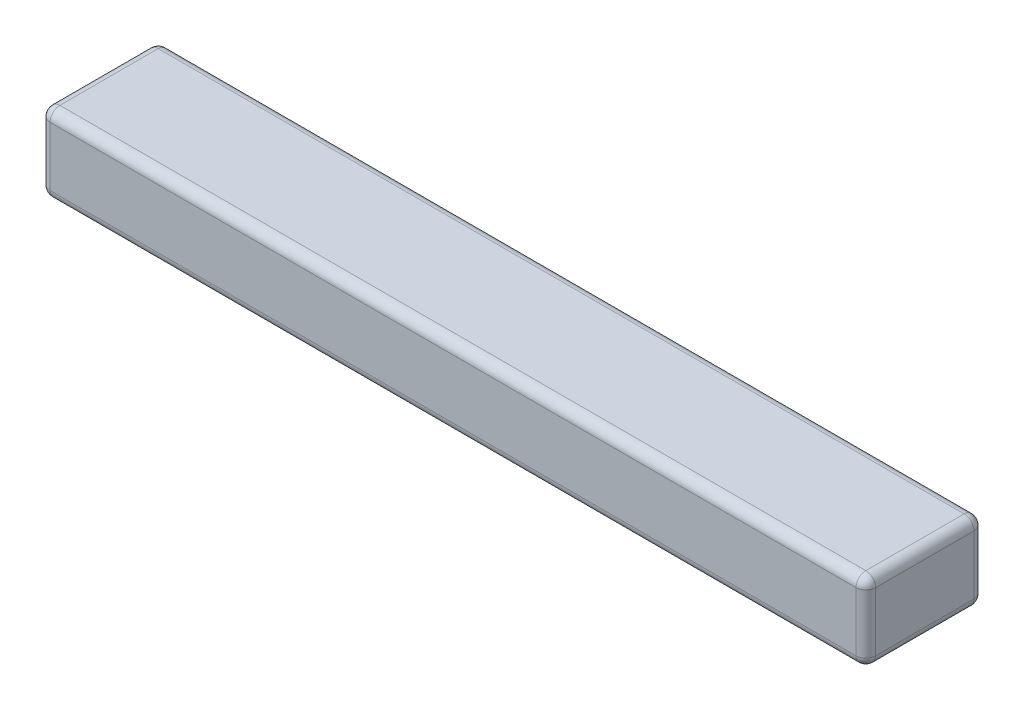
ISO-10303-21;
HEADER;
FILE_DESCRIPTION(('STEP AP214'),'2;1');
FILE_NAME('part.step','',(''),(''),'','','');
FILE_SCHEMA(('AUTOMOTIVE_DESIGN { 1 0 10303 214 1 1 1 1 }'));
ENDSEC;
DATA;
#1=APPLICATION_CONTEXT('core data for automotive mechanical design processes');
#2=APPLICATION_PROTOCOL_DEFINITION('international standard','automotive_design',2000,#1);
#3=PRODUCT_CONTEXT('',#1,'mechanical');
#4=PRODUCT('Part','Part','',(#3));
#5=PRODUCT_RELATED_PRODUCT_CATEGORY('part','',(#4));
#6=PRODUCT_DEFINITION_FORMATION('','',#4);
#7=PRODUCT_DEFINITION_CONTEXT('part definition',#1,'design');
#8=PRODUCT_DEFINITION('design','',#6,#7);
#9=PRODUCT_DEFINITION_SHAPE('','',#8);
#10=(LENGTH_UNIT() NAMED_UNIT(*) SI_UNIT(.MILLI.,.METRE.));
#11=(NAMED_UNIT(*) PLANE_ANGLE_UNIT() SI_UNIT($,.RADIAN.));
#12=(NAMED_UNIT(*) SI_UNIT($,.STERADIAN.) SOLID_ANGLE_UNIT());
#13=UNCERTAINTY_MEASURE_WITH_UNIT(LENGTH_MEASURE(1.E-05),#10,'distance_accuracy_value','');
#14=(GEOMETRIC_REPRESENTATION_CONTEXT(3) GLOBAL_UNCERTAINTY_ASSIGNED_CONTEXT((#13)) GLOBAL_UNIT_ASSIGNED_CONTEXT((#10,
#11,#12)) REPRESENTATION_CONTEXT('',''));
#15=CARTESIAN_POINT('',(0.,0.,0.));
#16=DIRECTION('',(0.,0.,1.));
#17=DIRECTION('',(1.,0.,0.));
#18=AXIS2_PLACEMENT_3D('',#15,#16,#17);
#19=CARTESIAN_POINT('',(210.,-20.,-30.));
#20=DIRECTION('',(0.,0.,1.));
#21=DIRECTION('',(1.,0.,0.));
#22=AXIS2_PLACEMENT_3D('',#19,#20,#21);
#23=PLANE('',#22);
#24=DIRECTION('',(0.,1.,0.));
#25=VECTOR('',#24,1.);
#26=CARTESIAN_POINT('',(205.,-20.,-30.));
#27=LINE('',#26,#25);
#28=CARTESIAN_POINT('',(205.,15.,-30.));
#29=VERTEX_POINT('',#28);
#30=CARTESIAN_POINT('',(205.,-15.,-30.));
#31=VERTEX_POINT('',#30);
#32=EDGE_CURVE('E175',#29,#31,#27,.F.);
#33=ORIENTED_EDGE('',*,*,#32,.T.);
#34=DIRECTION('',(-1.,0.,0.));
#35=VECTOR('',#34,1.);
#36=CARTESIAN_POINT('',(210.,-15.,-30.));
#37=LINE('',#36,#35);
#38=CARTESIAN_POINT('',(-205.,-15.,-30.));
#39=VERTEX_POINT('',#38);
#40=EDGE_CURVE('E180',#31,#39,#37,.T.);
#41=ORIENTED_EDGE('',*,*,#40,.T.);
#42=DIRECTION('',(0.,1.,0.));
#43=VECTOR('',#42,1.);
#44=CARTESIAN_POINT('',(-205.,20.,-30.));
#45=LINE('',#44,#43);
#46=CARTESIAN_POINT('',(-205.,15.,-30.));
#47=VERTEX_POINT('',#46);
#48=EDGE_CURVE('E177',#39,#47,#45,.T.);
#49=ORIENTED_EDGE('',*,*,#48,.T.);
#50=DIRECTION('',(-1.,0.,0.));
#51=VECTOR('',#50,1.);
#52=CARTESIAN_POINT('',(210.,15.,-30.));
#53=LINE('',#52,#51);
#54=EDGE_CURVE('E173',#47,#29,#53,.F.);
#55=ORIENTED_EDGE('',*,*,#54,.T.);
#56=EDGE_LOOP('',(#33,#41,#49,#55));
#57=FACE_BOUND('',#56,.T.);
#58=ADVANCED_FACE('F32',(#57),#23,.F.);
#59=CARTESIAN_POINT('',(210.,20.,30.));
#60=DIRECTION('',(0.,-1.,0.));
#61=DIRECTION('',(0.,0.,-1.));
#62=AXIS2_PLACEMENT_3D('',#59,#60,#61);
#63=PLANE('',#62);
#64=DIRECTION('',(0.,0.,1.));
#65=VECTOR('',#64,1.);
#66=CARTESIAN_POINT('',(205.,20.,30.));
#67=LINE('',#66,#65);
#68=CARTESIAN_POINT('',(205.,20.,25.));
#69=VERTEX_POINT('',#68);
#70=CARTESIAN_POINT('',(205.,20.,-25.));
#71=VERTEX_POINT('',#70);
#72=EDGE_CURVE('E184',#69,#71,#67,.F.);
#73=ORIENTED_EDGE('',*,*,#72,.T.);
#74=DIRECTION('',(-1.,0.,0.));
#75=VECTOR('',#74,1.);
#76=CARTESIAN_POINT('',(210.,20.,-25.));
#77=LINE('',#76,#75);
#78=CARTESIAN_POINT('',(-205.,20.,-25.));
#79=VERTEX_POINT('',#78);
#80=EDGE_CURVE('E189',#71,#79,#77,.T.);
#81=ORIENTED_EDGE('',*,*,#80,.T.);
#82=DIRECTION('',(0.,0.,1.));
#83=VECTOR('',#82,1.);
#84=CARTESIAN_POINT('',(-205.,20.,30.));
#85=LINE('',#84,#83);
#86=CARTESIAN_POINT('',(-205.,20.,25.));
#87=VERTEX_POINT('',#86);
#88=EDGE_CURVE('E186',#79,#87,#85,.T.);
#89=ORIENTED_EDGE('',*,*,#88,.T.);
#90=DIRECTION('',(-1.,0.,0.));
#91=VECTOR('',#90,1.);
#92=CARTESIAN_POINT('',(210.,20.,25.));
#93=LINE('',#92,#91);
#94=EDGE_CURVE('E182',#87,#69,#93,.F.);
#95=ORIENTED_EDGE('',*,*,#94,.T.);
#96=EDGE_LOOP('',(#73,#81,#89,#95));
#97=FACE_BOUND('',#96,.T.);
#98=ADVANCED_FACE('F286',(#97),#63,.F.);
#99=CARTESIAN_POINT('',(210.,-20.,30.));
#100=DIRECTION('',(0.,0.,-1.));
#101=DIRECTION('',(-1.,0.,0.));
#102=AXIS2_PLACEMENT_3D('',#99,#100,#101);
#103=PLANE('',#102);
#104=DIRECTION('',(0.,-1.,0.));
#105=VECTOR('',#104,1.);
#106=CARTESIAN_POINT('',(-205.,-20.,30.));
#107=LINE('',#106,#105);
#108=CARTESIAN_POINT('',(-205.,15.,30.));
#109=VERTEX_POINT('',#108);
#110=CARTESIAN_POINT('',(-205.,-15.,30.));
#111=VERTEX_POINT('',#110);
#112=EDGE_CURVE('E195',#109,#111,#107,.T.);
#113=ORIENTED_EDGE('',*,*,#112,.T.);
#114=DIRECTION('',(-1.,0.,0.));
#115=VECTOR('',#114,1.);
#116=CARTESIAN_POINT('',(210.,-15.,30.));
#117=LINE('',#116,#115);
#118=CARTESIAN_POINT('',(205.,-15.,30.));
#119=VERTEX_POINT('',#118);
#120=EDGE_CURVE('E198',#111,#119,#117,.F.);
#121=ORIENTED_EDGE('',*,*,#120,.T.);
#122=DIRECTION('',(0.,-1.,0.));
#123=VECTOR('',#122,1.);
#124=CARTESIAN_POINT('',(205.,-20.,30.));
#125=LINE('',#124,#123);
#126=CARTESIAN_POINT('',(205.,15.,30.));
#127=VERTEX_POINT('',#126);
#128=EDGE_CURVE('E193',#119,#127,#125,.F.);
#129=ORIENTED_EDGE('',*,*,#128,.T.);
#130=DIRECTION('',(-1.,0.,0.));
#131=VECTOR('',#130,1.);
#132=CARTESIAN_POINT('',(210.,15.,30.));
#133=LINE('',#132,#131);
#134=EDGE_CURVE('E191',#127,#109,#133,.T.);
#135=ORIENTED_EDGE('',*,*,#134,.T.);
#136=EDGE_LOOP('',(#113,#121,#129,#135));
#137=FACE_BOUND('',#136,.T.);
#138=ADVANCED_FACE('F306',(#137),#103,.F.);
#139=CARTESIAN_POINT('',(210.,-20.,30.));
#140=DIRECTION('',(0.,1.,0.));
#141=DIRECTION('',(0.,0.,1.));
#142=AXIS2_PLACEMENT_3D('',#139,#140,#141);
#143=PLANE('',#142);
#144=DIRECTION('',(0.,0.,-1.));
#145=VECTOR('',#144,1.);
#146=CARTESIAN_POINT('',(-205.,-20.,-30.));
#147=LINE('',#146,#145);
#148=CARTESIAN_POINT('',(-205.,-20.,25.));
#149=VERTEX_POINT('',#148);
#150=CARTESIAN_POINT('',(-205.,-20.,-25.));
#151=VERTEX_POINT('',#150);
#152=EDGE_CURVE('E135',#149,#151,#147,.T.);
#153=ORIENTED_EDGE('',*,*,#152,.T.);
#154=DIRECTION('',(-1.,0.,0.));
#155=VECTOR('',#154,1.);
#156=CARTESIAN_POINT('',(210.,-20.,-25.));
#157=LINE('',#156,#155);
#158=CARTESIAN_POINT('',(205.,-20.,-25.));
#159=VERTEX_POINT('',#158);
#160=EDGE_CURVE('E131',#151,#159,#157,.F.);
#161=ORIENTED_EDGE('',*,*,#160,.T.);
#162=DIRECTION('',(0.,0.,-1.));
#163=VECTOR('',#162,1.);
#164=CARTESIAN_POINT('',(205.,-20.,30.));
#165=LINE('',#164,#163);
#166=CARTESIAN_POINT('',(205.,-20.,25.));
#167=VERTEX_POINT('',#166);
#168=EDGE_CURVE('E123',#159,#167,#165,.F.);
#169=ORIENTED_EDGE('',*,*,#168,.T.);
#170=DIRECTION('',(-1.,0.,0.));
#171=VECTOR('',#170,1.);
#172=CARTESIAN_POINT('',(210.,-20.,25.));
#173=LINE('',#172,#171);
#174=EDGE_CURVE('E128',#167,#149,#173,.T.);
#175=ORIENTED_EDGE('',*,*,#174,.T.);
#176=EDGE_LOOP('',(#153,#161,#169,#175));
#177=FACE_BOUND('',#176,.T.);
#178=ADVANCED_FACE('F126',(#177),#143,.F.);
#179=CARTESIAN_POINT('',(210.,0.,0.));
#180=DIRECTION('',(-1.,0.,0.));
#181=DIRECTION('',(0.,0.,1.));
#182=AXIS2_PLACEMENT_3D('',#179,#180,#181);
#183=PLANE('',#182);
#184=DIRECTION('',(0.,0.,-1.));
#185=VECTOR('',#184,1.);
#186=CARTESIAN_POINT('',(210.,-15.,0.));
#187=LINE('',#186,#185);
#188=CARTESIAN_POINT('',(210.,-15.,25.));
#189=VERTEX_POINT('',#188);
#190=CARTESIAN_POINT('',(210.,-15.,-25.));
#191=VERTEX_POINT('',#190);
#192=EDGE_CURVE('E56',#189,#191,#187,.T.);
#193=ORIENTED_EDGE('',*,*,#192,.T.);
#194=DIRECTION('',(0.,1.,0.));
#195=VECTOR('',#194,1.);
#196=CARTESIAN_POINT('',(210.,0.,-25.));
#197=LINE('',#196,#195);
#198=CARTESIAN_POINT('',(210.,15.,-25.));
#199=VERTEX_POINT('',#198);
#200=EDGE_CURVE('E11',#191,#199,#197,.T.);
#201=ORIENTED_EDGE('',*,*,#200,.T.);
#202=DIRECTION('',(0.,0.,1.));
#203=VECTOR('',#202,1.);
#204=CARTESIAN_POINT('',(210.,15.,0.));
#205=LINE('',#204,#203);
#206=CARTESIAN_POINT('',(210.,15.,25.));
#207=VERTEX_POINT('',#206);
#208=EDGE_CURVE('E41',#199,#207,#205,.T.);
#209=ORIENTED_EDGE('',*,*,#208,.T.);
#210=DIRECTION('',(0.,-1.,0.));
#211=VECTOR('',#210,1.);
#212=CARTESIAN_POINT('',(210.,0.,25.));
#213=LINE('',#212,#211);
#214=EDGE_CURVE('E200',#207,#189,#213,.T.);
#215=ORIENTED_EDGE('',*,*,#214,.T.);
#216=EDGE_LOOP('',(#193,#201,#209,#215));
#217=FACE_BOUND('',#216,.T.);
#218=ADVANCED_FACE('F259',(#217),#183,.F.);
#219=CARTESIAN_POINT('',(-210.,0.,0.));
#220=DIRECTION('',(-1.,0.,0.));
#221=DIRECTION('',(0.,0.,1.));
#222=AXIS2_PLACEMENT_3D('',#219,#220,#221);
#223=PLANE('',#222);
#224=DIRECTION('',(0.,1.,0.));
#225=VECTOR('',#224,1.);
#226=CARTESIAN_POINT('',(-210.,-20.,-25.));
#227=LINE('',#226,#225);
#228=CARTESIAN_POINT('',(-210.,15.,-25.));
#229=VERTEX_POINT('',#228);
#230=CARTESIAN_POINT('',(-210.,-15.,-25.));
#231=VERTEX_POINT('',#230);
#232=EDGE_CURVE('E168',#229,#231,#227,.F.);
#233=ORIENTED_EDGE('',*,*,#232,.T.);
#234=DIRECTION('',(0.,0.,-1.));
#235=VECTOR('',#234,1.);
#236=CARTESIAN_POINT('',(-210.,-15.,30.));
#237=LINE('',#236,#235);
#238=CARTESIAN_POINT('',(-210.,-15.,25.));
#239=VERTEX_POINT('',#238);
#240=EDGE_CURVE('E170',#231,#239,#237,.F.);
#241=ORIENTED_EDGE('',*,*,#240,.T.);
#242=DIRECTION('',(0.,-1.,0.));
#243=VECTOR('',#242,1.);
#244=CARTESIAN_POINT('',(-210.,20.,25.));
#245=LINE('',#244,#243);
#246=CARTESIAN_POINT('',(-210.,15.,25.));
#247=VERTEX_POINT('',#246);
#248=EDGE_CURVE('E164',#239,#247,#245,.F.);
#249=ORIENTED_EDGE('',*,*,#248,.T.);
#250=DIRECTION('',(0.,0.,1.));
#251=VECTOR('',#250,1.);
#252=CARTESIAN_POINT('',(-210.,15.,-30.));
#253=LINE('',#252,#251);
#254=EDGE_CURVE('E166',#247,#229,#253,.F.);
#255=ORIENTED_EDGE('',*,*,#254,.T.);
#256=EDGE_LOOP('',(#233,#241,#249,#255));
#257=FACE_BOUND('',#256,.T.);
#258=ADVANCED_FACE('F339',(#257),#223,.T.);
#259=CARTESIAN_POINT('',(205.,15.,0.));
#260=DIRECTION('',(0.,0.,1.));
#261=DIRECTION('',(1.,0.,0.));
#262=AXIS2_PLACEMENT_3D('',#259,#260,#261);
#263=CYLINDRICAL_SURFACE('',#262,5.);
#264=CARTESIAN_POINT('',(205.,15.,25.));
#265=DIRECTION('',(0.,0.,1.));
#266=DIRECTION('',(1.,0.,0.));
#267=AXIS2_PLACEMENT_3D('',#264,#265,#266);
#268=CIRCLE('',#267,5.);
#269=EDGE_CURVE('E36',#207,#69,#268,.T.);
#270=ORIENTED_EDGE('',*,*,#269,.F.);
#271=ORIENTED_EDGE('',*,*,#208,.F.);
#272=CARTESIAN_POINT('',(205.,15.,-25.));
#273=DIRECTION('',(0.,0.,-1.));
#274=DIRECTION('',(-1.,0.,0.));
#275=AXIS2_PLACEMENT_3D('',#272,#273,#274);
#276=CIRCLE('',#275,5.);
#277=EDGE_CURVE('E160',#71,#199,#276,.T.);
#278=ORIENTED_EDGE('',*,*,#277,.F.);
#279=ORIENTED_EDGE('',*,*,#72,.F.);
#280=EDGE_LOOP('',(#270,#271,#278,#279));
#281=FACE_BOUND('',#280,.T.);
#282=ADVANCED_FACE('F34',(#281),#263,.T.);
#283=CARTESIAN_POINT('',(205.,15.,25.));
#284=DIRECTION('',(0.,0.,1.));
#285=DIRECTION('',(1.,0.,0.));
#286=AXIS2_PLACEMENT_3D('',#283,#284,#285);
#287=SPHERICAL_SURFACE('',#286,5.);
#288=CARTESIAN_POINT('',(205.,15.,25.));
#289=DIRECTION('',(0.,1.,0.));
#290=DIRECTION('',(-1.,0.,0.));
#291=AXIS2_PLACEMENT_3D('',#288,#289,#290);
#292=CIRCLE('',#291,5.);
#293=EDGE_CURVE('E244',#207,#127,#292,.F.);
#294=ORIENTED_EDGE('',*,*,#293,.F.);
#295=ORIENTED_EDGE('',*,*,#269,.T.);
#296=CARTESIAN_POINT('',(205.,15.,25.));
#297=DIRECTION('',(1.,0.,0.));
#298=DIRECTION('',(0.,0.,-1.));
#299=AXIS2_PLACEMENT_3D('',#296,#297,#298);
#300=CIRCLE('',#299,5.);
#301=EDGE_CURVE('E247',#127,#69,#300,.F.);
#302=ORIENTED_EDGE('',*,*,#301,.F.);
#303=EDGE_LOOP('',(#294,#295,#302));
#304=FACE_BOUND('',#303,.T.);
#305=ADVANCED_FACE('F300',(#304),#287,.T.);
#306=CARTESIAN_POINT('',(205.,15.,-25.));
#307=DIRECTION('',(0.,0.,1.));
#308=DIRECTION('',(1.,0.,0.));
#309=AXIS2_PLACEMENT_3D('',#306,#307,#308);
#310=SPHERICAL_SURFACE('',#309,5.);
#311=CARTESIAN_POINT('',(205.,15.,-25.));
#312=DIRECTION('',(1.,0.,0.));
#313=DIRECTION('',(0.,0.,-1.));
#314=AXIS2_PLACEMENT_3D('',#311,#312,#313);
#315=CIRCLE('',#314,5.);
#316=EDGE_CURVE('E240',#71,#29,#315,.F.);
#317=ORIENTED_EDGE('',*,*,#316,.F.);
#318=ORIENTED_EDGE('',*,*,#277,.T.);
#319=CARTESIAN_POINT('',(205.,15.,-25.));
#320=DIRECTION('',(0.,1.,0.));
#321=DIRECTION('',(0.,0.,1.));
#322=AXIS2_PLACEMENT_3D('',#319,#320,#321);
#323=CIRCLE('',#322,5.);
#324=EDGE_CURVE('E49',#29,#199,#323,.F.);
#325=ORIENTED_EDGE('',*,*,#324,.F.);
#326=EDGE_LOOP('',(#317,#318,#325));
#327=FACE_BOUND('',#326,.T.);
#328=ADVANCED_FACE('F253',(#327),#310,.T.);
#329=CARTESIAN_POINT('',(210.,15.,25.));
#330=DIRECTION('',(-1.,0.,0.));
#331=DIRECTION('',(0.,0.,1.));
#332=AXIS2_PLACEMENT_3D('',#329,#330,#331);
#333=CYLINDRICAL_SURFACE('',#332,5.);
#334=ORIENTED_EDGE('',*,*,#301,.T.);
#335=ORIENTED_EDGE('',*,*,#94,.F.);
#336=CARTESIAN_POINT('',(-205.,15.,25.));
#337=DIRECTION('',(-1.,0.,0.));
#338=DIRECTION('',(0.,0.,1.));
#339=AXIS2_PLACEMENT_3D('',#336,#337,#338);
#340=CIRCLE('',#339,5.);
#341=EDGE_CURVE('E235',#109,#87,#340,.T.);
#342=ORIENTED_EDGE('',*,*,#341,.F.);
#343=ORIENTED_EDGE('',*,*,#134,.F.);
#344=EDGE_LOOP('',(#334,#335,#342,#343));
#345=FACE_BOUND('',#344,.T.);
#346=ADVANCED_FACE('F296',(#345),#333,.T.);
#347=CARTESIAN_POINT('',(205.,0.,25.));
#348=DIRECTION('',(0.,-1.,0.));
#349=DIRECTION('',(0.,0.,-1.));
#350=AXIS2_PLACEMENT_3D('',#347,#348,#349);
#351=CYLINDRICAL_SURFACE('',#350,5.);
#352=ORIENTED_EDGE('',*,*,#293,.T.);
#353=ORIENTED_EDGE('',*,*,#128,.F.);
#354=CARTESIAN_POINT('',(205.,-15.,25.));
#355=DIRECTION('',(0.,-1.,0.));
#356=DIRECTION('',(0.,0.,-1.));
#357=AXIS2_PLACEMENT_3D('',#354,#355,#356);
#358=CIRCLE('',#357,5.);
#359=EDGE_CURVE('E144',#189,#119,#358,.T.);
#360=ORIENTED_EDGE('',*,*,#359,.F.);
#361=ORIENTED_EDGE('',*,*,#214,.F.);
#362=EDGE_LOOP('',(#352,#353,#360,#361));
#363=FACE_BOUND('',#362,.T.);
#364=ADVANCED_FACE('F304',(#363),#351,.T.);
#365=CARTESIAN_POINT('',(205.,-15.,0.));
#366=DIRECTION('',(0.,0.,-1.));
#367=DIRECTION('',(-1.,0.,0.));
#368=AXIS2_PLACEMENT_3D('',#365,#366,#367);
#369=CYLINDRICAL_SURFACE('',#368,5.);
#370=CARTESIAN_POINT('',(205.,-15.,-25.));
#371=DIRECTION('',(0.,0.,-1.));
#372=DIRECTION('',(-1.,0.,0.));
#373=AXIS2_PLACEMENT_3D('',#370,#371,#372);
#374=CIRCLE('',#373,5.);
#375=EDGE_CURVE('E145',#191,#159,#374,.T.);
#376=ORIENTED_EDGE('',*,*,#375,.F.);
#377=ORIENTED_EDGE('',*,*,#192,.F.);
#378=CARTESIAN_POINT('',(205.,-15.,25.));
#379=DIRECTION('',(0.,0.,1.));
#380=DIRECTION('',(1.,0.,0.));
#381=AXIS2_PLACEMENT_3D('',#378,#379,#380);
#382=CIRCLE('',#381,5.);
#383=EDGE_CURVE('E138',#167,#189,#382,.T.);
#384=ORIENTED_EDGE('',*,*,#383,.F.);
#385=ORIENTED_EDGE('',*,*,#168,.F.);
#386=EDGE_LOOP('',(#376,#377,#384,#385));
#387=FACE_BOUND('',#386,.T.);
#388=ADVANCED_FACE('F140',(#387),#369,.T.);
#389=CARTESIAN_POINT('',(205.,0.,-25.));
#390=DIRECTION('',(0.,1.,0.));
#391=DIRECTION('',(0.,0.,1.));
#392=AXIS2_PLACEMENT_3D('',#389,#390,#391);
#393=CYLINDRICAL_SURFACE('',#392,5.);
#394=ORIENTED_EDGE('',*,*,#324,.T.);
#395=ORIENTED_EDGE('',*,*,#200,.F.);
#396=CARTESIAN_POINT('',(205.,-15.,-25.));
#397=DIRECTION('',(0.,-1.,0.));
#398=DIRECTION('',(0.,0.,-1.));
#399=AXIS2_PLACEMENT_3D('',#396,#397,#398);
#400=CIRCLE('',#399,5.);
#401=EDGE_CURVE('E230',#31,#191,#400,.T.);
#402=ORIENTED_EDGE('',*,*,#401,.F.);
#403=ORIENTED_EDGE('',*,*,#32,.F.);
#404=EDGE_LOOP('',(#394,#395,#402,#403));
#405=FACE_BOUND('',#404,.T.);
#406=ADVANCED_FACE('F261',(#405),#393,.T.);
#407=CARTESIAN_POINT('',(210.,15.,-25.));
#408=DIRECTION('',(-1.,0.,0.));
#409=DIRECTION('',(0.,0.,1.));
#410=AXIS2_PLACEMENT_3D('',#407,#408,#409);
#411=CYLINDRICAL_SURFACE('',#410,5.);
#412=ORIENTED_EDGE('',*,*,#316,.T.);
#413=ORIENTED_EDGE('',*,*,#54,.F.);
#414=CARTESIAN_POINT('',(-205.,15.,-25.));
#415=DIRECTION('',(-1.,0.,0.));
#416=DIRECTION('',(0.,0.,1.));
#417=AXIS2_PLACEMENT_3D('',#414,#415,#416);
#418=CIRCLE('',#417,5.);
#419=EDGE_CURVE('E227',#79,#47,#418,.T.);
#420=ORIENTED_EDGE('',*,*,#419,.F.);
#421=ORIENTED_EDGE('',*,*,#80,.F.);
#422=EDGE_LOOP('',(#412,#413,#420,#421));
#423=FACE_BOUND('',#422,.T.);
#424=ADVANCED_FACE('F283',(#423),#411,.T.);
#425=CARTESIAN_POINT('',(-205.,15.,30.));
#426=DIRECTION('',(0.,0.,-1.));
#427=DIRECTION('',(-1.,0.,0.));
#428=AXIS2_PLACEMENT_3D('',#425,#426,#427);
#429=CYLINDRICAL_SURFACE('',#428,5.);
#430=CARTESIAN_POINT('',(-205.,15.,25.));
#431=DIRECTION('',(0.,0.,1.));
#432=DIRECTION('',(1.,0.,0.));
#433=AXIS2_PLACEMENT_3D('',#430,#431,#432);
#434=CIRCLE('',#433,5.);
#435=EDGE_CURVE('E237',#87,#247,#434,.T.);
#436=ORIENTED_EDGE('',*,*,#435,.F.);
#437=ORIENTED_EDGE('',*,*,#88,.F.);
#438=CARTESIAN_POINT('',(-205.,15.,-25.));
#439=DIRECTION('',(0.,0.,-1.));
#440=DIRECTION('',(0.,1.,0.));
#441=AXIS2_PLACEMENT_3D('',#438,#439,#440);
#442=CIRCLE('',#441,5.);
#443=EDGE_CURVE('E224',#229,#79,#442,.T.);
#444=ORIENTED_EDGE('',*,*,#443,.F.);
#445=ORIENTED_EDGE('',*,*,#254,.F.);
#446=EDGE_LOOP('',(#436,#437,#444,#445));
#447=FACE_BOUND('',#446,.T.);
#448=ADVANCED_FACE('F289',(#447),#429,.T.);
#449=CARTESIAN_POINT('',(-205.,15.,25.));
#450=DIRECTION('',(0.,0.,1.));
#451=DIRECTION('',(1.,0.,0.));
#452=AXIS2_PLACEMENT_3D('',#449,#450,#451);
#453=SPHERICAL_SURFACE('',#452,5.);
#454=ORIENTED_EDGE('',*,*,#341,.T.);
#455=ORIENTED_EDGE('',*,*,#435,.T.);
#456=CARTESIAN_POINT('',(-205.,15.,25.));
#457=DIRECTION('',(0.,1.,0.));
#458=DIRECTION('',(0.,0.,1.));
#459=AXIS2_PLACEMENT_3D('',#456,#457,#458);
#460=CIRCLE('',#459,5.);
#461=EDGE_CURVE('E152',#109,#247,#460,.F.);
#462=ORIENTED_EDGE('',*,*,#461,.F.);
#463=EDGE_LOOP('',(#454,#455,#462));
#464=FACE_BOUND('',#463,.T.);
#465=ADVANCED_FACE('F404',(#464),#453,.T.);
#466=CARTESIAN_POINT('',(205.,-15.,25.));
#467=DIRECTION('',(0.,0.,1.));
#468=DIRECTION('',(1.,0.,0.));
#469=AXIS2_PLACEMENT_3D('',#466,#467,#468);
#470=SPHERICAL_SURFACE('',#469,5.);
#471=ORIENTED_EDGE('',*,*,#383,.T.);
#472=ORIENTED_EDGE('',*,*,#359,.T.);
#473=CARTESIAN_POINT('',(205.,-15.,25.));
#474=DIRECTION('',(1.,0.,0.));
#475=DIRECTION('',(0.,0.,-1.));
#476=AXIS2_PLACEMENT_3D('',#473,#474,#475);
#477=CIRCLE('',#476,5.);
#478=EDGE_CURVE('E148',#167,#119,#477,.F.);
#479=ORIENTED_EDGE('',*,*,#478,.F.);
#480=EDGE_LOOP('',(#471,#472,#479));
#481=FACE_BOUND('',#480,.T.);
#482=ADVANCED_FACE('F149',(#481),#470,.T.);
#483=CARTESIAN_POINT('',(205.,-15.,-25.));
#484=DIRECTION('',(0.,0.,1.));
#485=DIRECTION('',(1.,0.,0.));
#486=AXIS2_PLACEMENT_3D('',#483,#484,#485);
#487=SPHERICAL_SURFACE('',#486,5.);
#488=ORIENTED_EDGE('',*,*,#401,.T.);
#489=ORIENTED_EDGE('',*,*,#375,.T.);
#490=CARTESIAN_POINT('',(205.,-15.,-25.));
#491=DIRECTION('',(1.,0.,0.));
#492=DIRECTION('',(0.,0.,-1.));
#493=AXIS2_PLACEMENT_3D('',#490,#491,#492);
#494=CIRCLE('',#493,5.);
#495=EDGE_CURVE('E153',#31,#159,#494,.F.);
#496=ORIENTED_EDGE('',*,*,#495,.F.);
#497=EDGE_LOOP('',(#488,#489,#496));
#498=FACE_BOUND('',#497,.T.);
#499=ADVANCED_FACE('F264',(#498),#487,.T.);
#500=CARTESIAN_POINT('',(-205.,15.,-25.));
#501=DIRECTION('',(0.,0.,1.));
#502=DIRECTION('',(1.,0.,0.));
#503=AXIS2_PLACEMENT_3D('',#500,#501,#502);
#504=SPHERICAL_SURFACE('',#503,5.);
#505=ORIENTED_EDGE('',*,*,#443,.T.);
#506=ORIENTED_EDGE('',*,*,#419,.T.);
#507=CARTESIAN_POINT('',(-205.,15.,-25.));
#508=DIRECTION('',(0.,1.,0.));
#509=DIRECTION('',(0.,0.,1.));
#510=AXIS2_PLACEMENT_3D('',#507,#508,#509);
#511=CIRCLE('',#510,5.);
#512=EDGE_CURVE('E218',#229,#47,#511,.F.);
#513=ORIENTED_EDGE('',*,*,#512,.F.);
#514=EDGE_LOOP('',(#505,#506,#513));
#515=FACE_BOUND('',#514,.T.);
#516=ADVANCED_FACE('F280',(#515),#504,.T.);
#517=CARTESIAN_POINT('',(-205.,-20.,25.));
#518=DIRECTION('',(0.,1.,0.));
#519=DIRECTION('',(0.,0.,1.));
#520=AXIS2_PLACEMENT_3D('',#517,#518,#519);
#521=CYLINDRICAL_SURFACE('',#520,5.);
#522=ORIENTED_EDGE('',*,*,#461,.T.);
#523=ORIENTED_EDGE('',*,*,#248,.F.);
#524=CARTESIAN_POINT('',(-205.,-15.,25.));
#525=DIRECTION('',(0.,-1.,0.));
#526=DIRECTION('',(0.,0.,-1.));
#527=AXIS2_PLACEMENT_3D('',#524,#525,#526);
#528=CIRCLE('',#527,5.);
#529=EDGE_CURVE('E215',#111,#239,#528,.T.);
#530=ORIENTED_EDGE('',*,*,#529,.F.);
#531=ORIENTED_EDGE('',*,*,#112,.F.);
#532=EDGE_LOOP('',(#522,#523,#530,#531));
#533=FACE_BOUND('',#532,.T.);
#534=ADVANCED_FACE('F310',(#533),#521,.T.);
#535=CARTESIAN_POINT('',(210.,-15.,25.));
#536=DIRECTION('',(-1.,0.,0.));
#537=DIRECTION('',(0.,0.,1.));
#538=AXIS2_PLACEMENT_3D('',#535,#536,#537);
#539=CYLINDRICAL_SURFACE('',#538,5.);
#540=ORIENTED_EDGE('',*,*,#478,.T.);
#541=ORIENTED_EDGE('',*,*,#120,.F.);
#542=CARTESIAN_POINT('',(-205.,-15.,25.));
#543=DIRECTION('',(-1.,0.,0.));
#544=DIRECTION('',(0.,0.,1.));
#545=AXIS2_PLACEMENT_3D('',#542,#543,#544);
#546=CIRCLE('',#545,5.);
#547=EDGE_CURVE('E156',#149,#111,#546,.T.);
#548=ORIENTED_EDGE('',*,*,#547,.F.);
#549=ORIENTED_EDGE('',*,*,#174,.F.);
#550=EDGE_LOOP('',(#540,#541,#548,#549));
#551=FACE_BOUND('',#550,.T.);
#552=ADVANCED_FACE('F155',(#551),#539,.T.);
#553=CARTESIAN_POINT('',(210.,-15.,-25.));
#554=DIRECTION('',(-1.,0.,0.));
#555=DIRECTION('',(0.,0.,1.));
#556=AXIS2_PLACEMENT_3D('',#553,#554,#555);
#557=CYLINDRICAL_SURFACE('',#556,5.);
#558=ORIENTED_EDGE('',*,*,#495,.T.);
#559=ORIENTED_EDGE('',*,*,#160,.F.);
#560=CARTESIAN_POINT('',(-205.,-15.,-25.));
#561=DIRECTION('',(-1.,0.,0.));
#562=DIRECTION('',(0.,0.,1.));
#563=AXIS2_PLACEMENT_3D('',#560,#561,#562);
#564=CIRCLE('',#563,5.);
#565=EDGE_CURVE('E211',#39,#151,#564,.T.);
#566=ORIENTED_EDGE('',*,*,#565,.F.);
#567=ORIENTED_EDGE('',*,*,#40,.F.);
#568=EDGE_LOOP('',(#558,#559,#566,#567));
#569=FACE_BOUND('',#568,.T.);
#570=ADVANCED_FACE('F268',(#569),#557,.T.);
#571=CARTESIAN_POINT('',(-205.,-20.,-25.));
#572=DIRECTION('',(0.,-1.,0.));
#573=DIRECTION('',(0.,0.,-1.));
#574=AXIS2_PLACEMENT_3D('',#571,#572,#573);
#575=CYLINDRICAL_SURFACE('',#574,5.);
#576=ORIENTED_EDGE('',*,*,#512,.T.);
#577=ORIENTED_EDGE('',*,*,#48,.F.);
#578=CARTESIAN_POINT('',(-205.,-15.,-25.));
#579=DIRECTION('',(0.,-1.,0.));
#580=DIRECTION('',(0.,0.,-1.));
#581=AXIS2_PLACEMENT_3D('',#578,#579,#580);
#582=CIRCLE('',#581,5.);
#583=EDGE_CURVE('E208',#231,#39,#582,.T.);
#584=ORIENTED_EDGE('',*,*,#583,.F.);
#585=ORIENTED_EDGE('',*,*,#232,.F.);
#586=EDGE_LOOP('',(#576,#577,#584,#585));
#587=FACE_BOUND('',#586,.T.);
#588=ADVANCED_FACE('F273',(#587),#575,.T.);
#589=CARTESIAN_POINT('',(-205.,-15.,25.));
#590=DIRECTION('',(0.,0.,1.));
#591=DIRECTION('',(1.,0.,0.));
#592=AXIS2_PLACEMENT_3D('',#589,#590,#591);
#593=SPHERICAL_SURFACE('',#592,5.);
#594=ORIENTED_EDGE('',*,*,#547,.T.);
#595=ORIENTED_EDGE('',*,*,#529,.T.);
#596=CARTESIAN_POINT('',(-205.,-15.,25.));
#597=DIRECTION('',(0.,0.,1.));
#598=DIRECTION('',(1.,0.,0.));
#599=AXIS2_PLACEMENT_3D('',#596,#597,#598);
#600=CIRCLE('',#599,5.);
#601=EDGE_CURVE('E206',#149,#239,#600,.F.);
#602=ORIENTED_EDGE('',*,*,#601,.F.);
#603=EDGE_LOOP('',(#594,#595,#602));
#604=FACE_BOUND('',#603,.T.);
#605=ADVANCED_FACE('F313',(#604),#593,.T.);
#606=CARTESIAN_POINT('',(-205.,-15.,-25.));
#607=DIRECTION('',(0.,0.,1.));
#608=DIRECTION('',(1.,0.,0.));
#609=AXIS2_PLACEMENT_3D('',#606,#607,#608);
#610=SPHERICAL_SURFACE('',#609,5.);
#611=ORIENTED_EDGE('',*,*,#583,.T.);
#612=ORIENTED_EDGE('',*,*,#565,.T.);
#613=CARTESIAN_POINT('',(-205.,-15.,-25.));
#614=DIRECTION('',(0.,0.,-1.));
#615=DIRECTION('',(-1.,0.,0.));
#616=AXIS2_PLACEMENT_3D('',#613,#614,#615);
#617=CIRCLE('',#616,5.);
#618=EDGE_CURVE('E204',#231,#151,#617,.F.);
#619=ORIENTED_EDGE('',*,*,#618,.F.);
#620=EDGE_LOOP('',(#611,#612,#619));
#621=FACE_BOUND('',#620,.T.);
#622=ADVANCED_FACE('F319',(#621),#610,.T.);
#623=CARTESIAN_POINT('',(-205.,-15.,30.));
#624=DIRECTION('',(0.,0.,1.));
#625=DIRECTION('',(1.,0.,0.));
#626=AXIS2_PLACEMENT_3D('',#623,#624,#625);
#627=CYLINDRICAL_SURFACE('',#626,5.);
#628=ORIENTED_EDGE('',*,*,#601,.T.);
#629=ORIENTED_EDGE('',*,*,#240,.F.);
#630=ORIENTED_EDGE('',*,*,#618,.T.);
#631=ORIENTED_EDGE('',*,*,#152,.F.);
#632=EDGE_LOOP('',(#628,#629,#630,#631));
#633=FACE_BOUND('',#632,.T.);
#634=ADVANCED_FACE('F316',(#633),#627,.T.);
#635=CLOSED_SHELL('',(#58,#98,#138,#178,#218,#258,#282,#305,#328,#346,#364,#388,#406,#424,#448,
#465,#482,#499,#516,#534,#552,#570,#588,#605,#622,#634));
#636=MANIFOLD_SOLID_BREP('B2',#635);
#637=ADVANCED_BREP_SHAPE_REPRESENTATION('',(#18,#636),#14);
#638=SHAPE_DEFINITION_REPRESENTATION(#9,#637);
ENDSEC;
END-ISO-10303-21;
